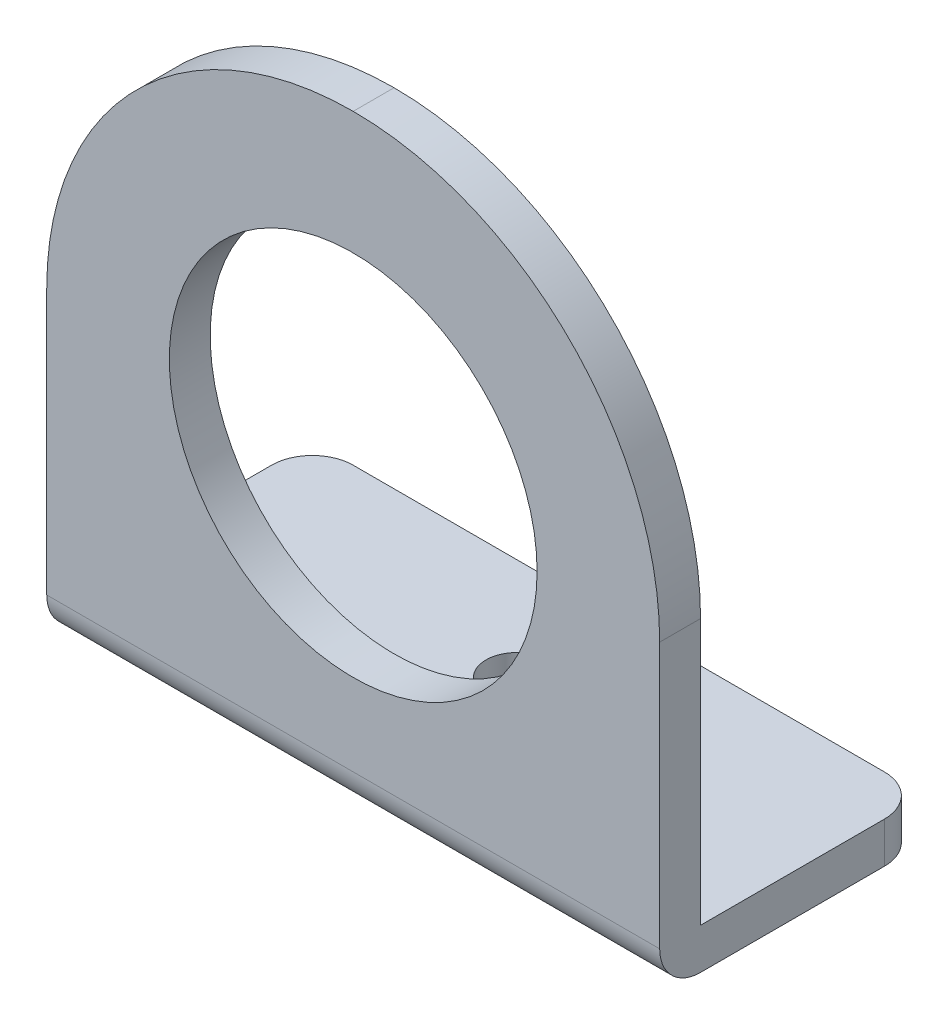
ISO-10303-21;
HEADER;
FILE_DESCRIPTION(('STEP AP214'),'2;1');
FILE_NAME('part.step','',(''),(''),'','','');
FILE_SCHEMA(('AUTOMOTIVE_DESIGN { 1 0 10303 214 1 1 1 1 }'));
ENDSEC;
DATA;
#1=APPLICATION_CONTEXT('core data for automotive mechanical design processes');
#2=APPLICATION_PROTOCOL_DEFINITION('international standard','automotive_design',2000,#1);
#3=PRODUCT_CONTEXT('',#1,'mechanical');
#4=PRODUCT('Part','Part','',(#3));
#5=PRODUCT_RELATED_PRODUCT_CATEGORY('part','',(#4));
#6=PRODUCT_DEFINITION_FORMATION('','',#4);
#7=PRODUCT_DEFINITION_CONTEXT('part definition',#1,'design');
#8=PRODUCT_DEFINITION('design','',#6,#7);
#9=PRODUCT_DEFINITION_SHAPE('','',#8);
#10=(LENGTH_UNIT() NAMED_UNIT(*) SI_UNIT(.MILLI.,.METRE.));
#11=(NAMED_UNIT(*) PLANE_ANGLE_UNIT() SI_UNIT($,.RADIAN.));
#12=(NAMED_UNIT(*) SI_UNIT($,.STERADIAN.) SOLID_ANGLE_UNIT());
#13=UNCERTAINTY_MEASURE_WITH_UNIT(LENGTH_MEASURE(1.E-05),#10,'distance_accuracy_value','');
#14=(GEOMETRIC_REPRESENTATION_CONTEXT(3) GLOBAL_UNCERTAINTY_ASSIGNED_CONTEXT((#13)) GLOBAL_UNIT_ASSIGNED_CONTEXT((#10,
#11,#12)) REPRESENTATION_CONTEXT('',''));
#15=CARTESIAN_POINT('',(0.,0.,0.));
#16=DIRECTION('',(0.,0.,1.));
#17=DIRECTION('',(1.,0.,0.));
#18=AXIS2_PLACEMENT_3D('',#15,#16,#17);
#19=CARTESIAN_POINT('',(-15.,15.,2.));
#20=DIRECTION('',(1.,0.,0.));
#21=DIRECTION('',(0.,1.,0.));
#22=AXIS2_PLACEMENT_3D('',#19,#20,#21);
#23=PLANE('',#22);
#24=DIRECTION('',(0.,0.,-1.));
#25=VECTOR('',#24,1.);
#26=CARTESIAN_POINT('',(-15.,-15.,2.));
#27=LINE('',#26,#25);
#28=CARTESIAN_POINT('',(-15.,-15.,0.));
#29=VERTEX_POINT('',#28);
#30=CARTESIAN_POINT('',(-15.,-15.,-9.));
#31=VERTEX_POINT('',#30);
#32=EDGE_CURVE('E161',#29,#31,#27,.T.);
#33=ORIENTED_EDGE('',*,*,#32,.F.);
#34=CARTESIAN_POINT('',(-15.,-13.,0.));
#35=DIRECTION('',(1.,0.,0.));
#36=DIRECTION('',(0.,1.,0.));
#37=AXIS2_PLACEMENT_3D('',#34,#35,#36);
#38=CIRCLE('',#37,2.);
#39=CARTESIAN_POINT('',(-15.,-13.,2.));
#40=VERTEX_POINT('',#39);
#41=EDGE_CURVE('E192',#29,#40,#38,.F.);
#42=ORIENTED_EDGE('',*,*,#41,.T.);
#43=DIRECTION('',(0.,-1.,0.));
#44=VECTOR('',#43,1.);
#45=CARTESIAN_POINT('',(-15.,15.,2.));
#46=LINE('',#45,#44);
#47=CARTESIAN_POINT('',(-15.,0.,2.));
#48=VERTEX_POINT('',#47);
#49=EDGE_CURVE('E131',#48,#40,#46,.T.);
#50=ORIENTED_EDGE('',*,*,#49,.F.);
#51=DIRECTION('',(0.,0.,-1.));
#52=VECTOR('',#51,1.);
#53=CARTESIAN_POINT('',(-15.,0.,2.));
#54=LINE('',#53,#52);
#55=CARTESIAN_POINT('',(-15.,0.,0.));
#56=VERTEX_POINT('',#55);
#57=EDGE_CURVE('E164',#48,#56,#54,.T.);
#58=ORIENTED_EDGE('',*,*,#57,.T.);
#59=DIRECTION('',(0.,-1.,0.));
#60=VECTOR('',#59,1.);
#61=CARTESIAN_POINT('',(-15.,15.,0.));
#62=LINE('',#61,#60);
#63=CARTESIAN_POINT('',(-15.,-13.,0.));
#64=VERTEX_POINT('',#63);
#65=EDGE_CURVE('E132',#56,#64,#62,.T.);
#66=ORIENTED_EDGE('',*,*,#65,.T.);
#67=DIRECTION('',(0.,0.,1.));
#68=VECTOR('',#67,1.);
#69=CARTESIAN_POINT('',(-15.,-13.,-11.));
#70=LINE('',#69,#68);
#71=CARTESIAN_POINT('',(-15.,-13.,-9.));
#72=VERTEX_POINT('',#71);
#73=EDGE_CURVE('E118',#72,#64,#70,.T.);
#74=ORIENTED_EDGE('',*,*,#73,.F.);
#75=DIRECTION('',(0.,1.,0.));
#76=VECTOR('',#75,1.);
#77=CARTESIAN_POINT('',(-15.,15.,-9.));
#78=LINE('',#77,#76);
#79=EDGE_CURVE('E190',#72,#31,#78,.F.);
#80=ORIENTED_EDGE('',*,*,#79,.T.);
#81=EDGE_LOOP('',(#33,#42,#50,#58,#66,#74,#80));
#82=FACE_BOUND('',#81,.T.);
#83=ADVANCED_FACE('F32',(#82),#23,.F.);
#84=CARTESIAN_POINT('',(15.,-15.,2.));
#85=DIRECTION('',(0.,1.,0.));
#86=DIRECTION('',(-1.,0.,0.));
#87=AXIS2_PLACEMENT_3D('',#84,#85,#86);
#88=PLANE('',#87);
#89=CARTESIAN_POINT('',(0.,-15.,-6.));
#90=DIRECTION('',(0.,1.,0.));
#91=DIRECTION('',(0.,0.,1.));
#92=AXIS2_PLACEMENT_3D('',#89,#90,#91);
#93=CIRCLE('',#92,1.5);
#94=CARTESIAN_POINT('',(0.,-15.,-4.5));
#95=VERTEX_POINT('',#94);
#96=EDGE_CURVE('E137',#95,#95,#93,.T.);
#97=ORIENTED_EDGE('',*,*,#96,.T.);
#98=EDGE_LOOP('',(#97));
#99=FACE_BOUND('',#98,.T.);
#100=DIRECTION('',(0.,0.,-1.));
#101=VECTOR('',#100,1.);
#102=CARTESIAN_POINT('',(15.,-15.,2.));
#103=LINE('',#102,#101);
#104=CARTESIAN_POINT('',(15.,-15.,0.));
#105=VERTEX_POINT('',#104);
#106=CARTESIAN_POINT('',(15.,-15.,-9.));
#107=VERTEX_POINT('',#106);
#108=EDGE_CURVE('E158',#105,#107,#103,.T.);
#109=ORIENTED_EDGE('',*,*,#108,.F.);
#110=DIRECTION('',(1.,0.,0.));
#111=VECTOR('',#110,1.);
#112=CARTESIAN_POINT('',(15.,-15.,0.));
#113=LINE('',#112,#111);
#114=EDGE_CURVE('E188',#105,#29,#113,.F.);
#115=ORIENTED_EDGE('',*,*,#114,.T.);
#116=ORIENTED_EDGE('',*,*,#32,.T.);
#117=CARTESIAN_POINT('',(-13.,-15.,-9.));
#118=DIRECTION('',(0.,1.,0.));
#119=DIRECTION('',(-1.,0.,0.));
#120=AXIS2_PLACEMENT_3D('',#117,#118,#119);
#121=CIRCLE('',#120,2.);
#122=CARTESIAN_POINT('',(-13.,-15.,-11.));
#123=VERTEX_POINT('',#122);
#124=EDGE_CURVE('E186',#31,#123,#121,.F.);
#125=ORIENTED_EDGE('',*,*,#124,.T.);
#126=DIRECTION('',(-1.,0.,0.));
#127=VECTOR('',#126,1.);
#128=CARTESIAN_POINT('',(15.,-15.,-11.));
#129=LINE('',#128,#127);
#130=CARTESIAN_POINT('',(13.,-15.,-11.));
#131=VERTEX_POINT('',#130);
#132=EDGE_CURVE('E136',#131,#123,#129,.T.);
#133=ORIENTED_EDGE('',*,*,#132,.F.);
#134=CARTESIAN_POINT('',(13.,-15.,-9.));
#135=DIRECTION('',(0.,1.,0.));
#136=DIRECTION('',(-1.,0.,0.));
#137=AXIS2_PLACEMENT_3D('',#134,#135,#136);
#138=CIRCLE('',#137,2.);
#139=EDGE_CURVE('E184',#131,#107,#138,.F.);
#140=ORIENTED_EDGE('',*,*,#139,.T.);
#141=EDGE_LOOP('',(#109,#115,#116,#125,#133,#140));
#142=FACE_BOUND('',#141,.T.);
#143=ADVANCED_FACE('F208',(#99,#142),#88,.F.);
#144=CARTESIAN_POINT('',(15.,15.,2.));
#145=DIRECTION('',(-1.,0.,0.));
#146=DIRECTION('',(0.,-1.,0.));
#147=AXIS2_PLACEMENT_3D('',#144,#145,#146);
#148=PLANE('',#147);
#149=DIRECTION('',(0.,1.,0.));
#150=VECTOR('',#149,1.);
#151=CARTESIAN_POINT('',(15.,15.,2.));
#152=LINE('',#151,#150);
#153=CARTESIAN_POINT('',(15.,-13.,2.));
#154=VERTEX_POINT('',#153);
#155=CARTESIAN_POINT('',(15.,0.,2.));
#156=VERTEX_POINT('',#155);
#157=EDGE_CURVE('E156',#154,#156,#152,.T.);
#158=ORIENTED_EDGE('',*,*,#157,.F.);
#159=CARTESIAN_POINT('',(15.,-13.,0.));
#160=DIRECTION('',(-1.,0.,0.));
#161=DIRECTION('',(0.,-1.,0.));
#162=AXIS2_PLACEMENT_3D('',#159,#160,#161);
#163=CIRCLE('',#162,2.);
#164=EDGE_CURVE('E182',#154,#105,#163,.F.);
#165=ORIENTED_EDGE('',*,*,#164,.T.);
#166=ORIENTED_EDGE('',*,*,#108,.T.);
#167=DIRECTION('',(0.,-1.,0.));
#168=VECTOR('',#167,1.);
#169=CARTESIAN_POINT('',(15.,15.,-9.));
#170=LINE('',#169,#168);
#171=CARTESIAN_POINT('',(15.,-13.,-9.));
#172=VERTEX_POINT('',#171);
#173=EDGE_CURVE('E116',#107,#172,#170,.F.);
#174=ORIENTED_EDGE('',*,*,#173,.T.);
#175=DIRECTION('',(0.,0.,1.));
#176=VECTOR('',#175,1.);
#177=CARTESIAN_POINT('',(15.,-13.,-11.));
#178=LINE('',#177,#176);
#179=CARTESIAN_POINT('',(15.,-13.,0.));
#180=VERTEX_POINT('',#179);
#181=EDGE_CURVE('E107',#172,#180,#178,.T.);
#182=ORIENTED_EDGE('',*,*,#181,.T.);
#183=DIRECTION('',(0.,1.,0.));
#184=VECTOR('',#183,1.);
#185=CARTESIAN_POINT('',(15.,15.,0.));
#186=LINE('',#185,#184);
#187=CARTESIAN_POINT('',(15.,0.,0.));
#188=VERTEX_POINT('',#187);
#189=EDGE_CURVE('E112',#180,#188,#186,.T.);
#190=ORIENTED_EDGE('',*,*,#189,.T.);
#191=DIRECTION('',(0.,0.,-1.));
#192=VECTOR('',#191,1.);
#193=CARTESIAN_POINT('',(15.,0.,2.));
#194=LINE('',#193,#192);
#195=EDGE_CURVE('E174',#188,#156,#194,.F.);
#196=ORIENTED_EDGE('',*,*,#195,.T.);
#197=EDGE_LOOP('',(#158,#165,#166,#174,#182,#190,#196));
#198=FACE_BOUND('',#197,.T.);
#199=ADVANCED_FACE('F110',(#198),#148,.F.);
#200=CARTESIAN_POINT('',(0.,0.,2.));
#201=DIRECTION('',(0.,0.,-1.));
#202=DIRECTION('',(-1.,0.,0.));
#203=AXIS2_PLACEMENT_3D('',#200,#201,#202);
#204=PLANE('',#203);
#205=CARTESIAN_POINT('',(0.,0.,2.));
#206=DIRECTION('',(0.,0.,1.));
#207=DIRECTION('',(1.,0.,0.));
#208=AXIS2_PLACEMENT_3D('',#205,#206,#207);
#209=CIRCLE('',#208,9.);
#210=CARTESIAN_POINT('',(9.,0.,2.));
#211=VERTEX_POINT('',#210);
#212=EDGE_CURVE('E151',#211,#211,#209,.T.);
#213=ORIENTED_EDGE('',*,*,#212,.F.);
#214=EDGE_LOOP('',(#213));
#215=FACE_BOUND('',#214,.T.);
#216=ORIENTED_EDGE('',*,*,#49,.T.);
#217=DIRECTION('',(1.,0.,0.));
#218=VECTOR('',#217,1.);
#219=CARTESIAN_POINT('',(0.,-13.,2.));
#220=LINE('',#219,#218);
#221=EDGE_CURVE('E176',#40,#154,#220,.T.);
#222=ORIENTED_EDGE('',*,*,#221,.T.);
#223=ORIENTED_EDGE('',*,*,#157,.T.);
#224=CARTESIAN_POINT('',(0.,0.,2.));
#225=DIRECTION('',(0.,0.,-1.));
#226=DIRECTION('',(-1.,0.,0.));
#227=AXIS2_PLACEMENT_3D('',#224,#225,#226);
#228=CIRCLE('',#227,15.);
#229=CARTESIAN_POINT('',(0.,15.,2.));
#230=VERTEX_POINT('',#229);
#231=EDGE_CURVE('E170',#156,#230,#228,.F.);
#232=ORIENTED_EDGE('',*,*,#231,.T.);
#233=CARTESIAN_POINT('',(0.,0.,2.));
#234=DIRECTION('',(0.,0.,-1.));
#235=DIRECTION('',(-1.,0.,0.));
#236=AXIS2_PLACEMENT_3D('',#233,#234,#235);
#237=CIRCLE('',#236,15.);
#238=EDGE_CURVE('E172',#230,#48,#237,.F.);
#239=ORIENTED_EDGE('',*,*,#238,.T.);
#240=EDGE_LOOP('',(#216,#222,#223,#232,#239));
#241=FACE_BOUND('',#240,.T.);
#242=ADVANCED_FACE('F216',(#215,#241),#204,.F.);
#243=CARTESIAN_POINT('',(0.,0.,0.));
#244=DIRECTION('',(0.,0.,-1.));
#245=DIRECTION('',(-1.,0.,0.));
#246=AXIS2_PLACEMENT_3D('',#243,#244,#245);
#247=PLANE('',#246);
#248=DIRECTION('',(1.,0.,0.));
#249=VECTOR('',#248,1.);
#250=CARTESIAN_POINT('',(15.,-13.,0.));
#251=LINE('',#250,#249);
#252=EDGE_CURVE('E126',#64,#180,#251,.T.);
#253=ORIENTED_EDGE('',*,*,#252,.F.);
#254=ORIENTED_EDGE('',*,*,#65,.F.);
#255=CARTESIAN_POINT('',(0.,0.,0.));
#256=DIRECTION('',(0.,0.,-1.));
#257=DIRECTION('',(-1.,0.,0.));
#258=AXIS2_PLACEMENT_3D('',#255,#256,#257);
#259=CIRCLE('',#258,15.);
#260=CARTESIAN_POINT('',(0.,15.,0.));
#261=VERTEX_POINT('',#260);
#262=EDGE_CURVE('E168',#56,#261,#259,.T.);
#263=ORIENTED_EDGE('',*,*,#262,.T.);
#264=CARTESIAN_POINT('',(0.,0.,0.));
#265=DIRECTION('',(0.,0.,-1.));
#266=DIRECTION('',(-1.,0.,0.));
#267=AXIS2_PLACEMENT_3D('',#264,#265,#266);
#268=CIRCLE('',#267,15.);
#269=EDGE_CURVE('E129',#261,#188,#268,.T.);
#270=ORIENTED_EDGE('',*,*,#269,.T.);
#271=ORIENTED_EDGE('',*,*,#189,.F.);
#272=EDGE_LOOP('',(#253,#254,#263,#270,#271));
#273=FACE_BOUND('',#272,.T.);
#274=CARTESIAN_POINT('',(0.,0.,0.));
#275=DIRECTION('',(0.,0.,1.));
#276=DIRECTION('',(1.,0.,0.));
#277=AXIS2_PLACEMENT_3D('',#274,#275,#276);
#278=CIRCLE('',#277,9.);
#279=CARTESIAN_POINT('',(9.,0.,0.));
#280=VERTEX_POINT('',#279);
#281=EDGE_CURVE('E148',#280,#280,#278,.T.);
#282=ORIENTED_EDGE('',*,*,#281,.T.);
#283=EDGE_LOOP('',(#282));
#284=FACE_BOUND('',#283,.T.);
#285=ADVANCED_FACE('F123',(#273,#284),#247,.T.);
#286=CARTESIAN_POINT('',(0.,0.,0.));
#287=DIRECTION('',(0.,0.,1.));
#288=DIRECTION('',(1.,0.,0.));
#289=AXIS2_PLACEMENT_3D('',#286,#287,#288);
#290=CYLINDRICAL_SURFACE('',#289,9.);
#291=ORIENTED_EDGE('',*,*,#281,.F.);
#292=EDGE_LOOP('',(#291));
#293=FACE_BOUND('',#292,.T.);
#294=ORIENTED_EDGE('',*,*,#212,.T.);
#295=EDGE_LOOP('',(#294));
#296=FACE_BOUND('',#295,.T.);
#297=ADVANCED_FACE('F233',(#293,#296),#290,.F.);
#298=CARTESIAN_POINT('',(0.,0.,2.));
#299=DIRECTION('',(0.,0.,-1.));
#300=DIRECTION('',(-1.,0.,0.));
#301=AXIS2_PLACEMENT_3D('',#298,#299,#300);
#302=CYLINDRICAL_SURFACE('',#301,15.);
#303=DIRECTION('',(0.,0.,-1.));
#304=VECTOR('',#303,1.);
#305=CARTESIAN_POINT('',(0.,15.,2.));
#306=LINE('',#305,#304);
#307=EDGE_CURVE('E147',#230,#261,#306,.T.);
#308=ORIENTED_EDGE('',*,*,#307,.F.);
#309=ORIENTED_EDGE('',*,*,#231,.F.);
#310=ORIENTED_EDGE('',*,*,#195,.F.);
#311=ORIENTED_EDGE('',*,*,#269,.F.);
#312=EDGE_LOOP('',(#308,#309,#310,#311));
#313=FACE_BOUND('',#312,.T.);
#314=ADVANCED_FACE('F220',(#313),#302,.T.);
#315=CARTESIAN_POINT('',(0.,0.,2.));
#316=DIRECTION('',(0.,0.,-1.));
#317=DIRECTION('',(-1.,0.,0.));
#318=AXIS2_PLACEMENT_3D('',#315,#316,#317);
#319=CYLINDRICAL_SURFACE('',#318,15.);
#320=ORIENTED_EDGE('',*,*,#238,.F.);
#321=ORIENTED_EDGE('',*,*,#307,.T.);
#322=ORIENTED_EDGE('',*,*,#262,.F.);
#323=ORIENTED_EDGE('',*,*,#57,.F.);
#324=EDGE_LOOP('',(#320,#321,#322,#323));
#325=FACE_BOUND('',#324,.T.);
#326=ADVANCED_FACE('F224',(#325),#319,.T.);
#327=CARTESIAN_POINT('',(15.,-13.,-11.));
#328=DIRECTION('',(0.,-1.,0.));
#329=DIRECTION('',(0.,0.,-1.));
#330=AXIS2_PLACEMENT_3D('',#327,#328,#329);
#331=PLANE('',#330);
#332=CARTESIAN_POINT('',(0.,-13.,-6.));
#333=DIRECTION('',(0.,1.,0.));
#334=DIRECTION('',(0.,0.,1.));
#335=AXIS2_PLACEMENT_3D('',#332,#333,#334);
#336=CIRCLE('',#335,1.5);
#337=CARTESIAN_POINT('',(0.,-13.,-4.5));
#338=VERTEX_POINT('',#337);
#339=EDGE_CURVE('E142',#338,#338,#336,.T.);
#340=ORIENTED_EDGE('',*,*,#339,.F.);
#341=EDGE_LOOP('',(#340));
#342=FACE_BOUND('',#341,.T.);
#343=DIRECTION('',(1.,0.,0.));
#344=VECTOR('',#343,1.);
#345=CARTESIAN_POINT('',(15.,-13.,-11.));
#346=LINE('',#345,#344);
#347=CARTESIAN_POINT('',(-13.,-13.,-11.));
#348=VERTEX_POINT('',#347);
#349=CARTESIAN_POINT('',(13.,-13.,-11.));
#350=VERTEX_POINT('',#349);
#351=EDGE_CURVE('E119',#348,#350,#346,.T.);
#352=ORIENTED_EDGE('',*,*,#351,.F.);
#353=CARTESIAN_POINT('',(-13.,-13.,-9.));
#354=DIRECTION('',(0.,-1.,0.));
#355=DIRECTION('',(0.,0.,-1.));
#356=AXIS2_PLACEMENT_3D('',#353,#354,#355);
#357=CIRCLE('',#356,2.);
#358=EDGE_CURVE('E11',#348,#72,#357,.F.);
#359=ORIENTED_EDGE('',*,*,#358,.T.);
#360=ORIENTED_EDGE('',*,*,#73,.T.);
#361=ORIENTED_EDGE('',*,*,#252,.T.);
#362=ORIENTED_EDGE('',*,*,#181,.F.);
#363=CARTESIAN_POINT('',(13.,-13.,-9.));
#364=DIRECTION('',(0.,-1.,0.));
#365=DIRECTION('',(0.,0.,-1.));
#366=AXIS2_PLACEMENT_3D('',#363,#364,#365);
#367=CIRCLE('',#366,2.);
#368=EDGE_CURVE('E40',#172,#350,#367,.F.);
#369=ORIENTED_EDGE('',*,*,#368,.T.);
#370=EDGE_LOOP('',(#352,#359,#360,#361,#362,#369));
#371=FACE_BOUND('',#370,.T.);
#372=ADVANCED_FACE('F134',(#342,#371),#331,.F.);
#373=CARTESIAN_POINT('',(0.,0.,-11.));
#374=DIRECTION('',(0.,0.,1.));
#375=DIRECTION('',(1.,0.,0.));
#376=AXIS2_PLACEMENT_3D('',#373,#374,#375);
#377=PLANE('',#376);
#378=ORIENTED_EDGE('',*,*,#132,.T.);
#379=DIRECTION('',(0.,1.,0.));
#380=VECTOR('',#379,1.);
#381=CARTESIAN_POINT('',(-13.,0.,-11.));
#382=LINE('',#381,#380);
#383=EDGE_CURVE('E197',#123,#348,#382,.T.);
#384=ORIENTED_EDGE('',*,*,#383,.T.);
#385=ORIENTED_EDGE('',*,*,#351,.T.);
#386=DIRECTION('',(0.,-1.,0.));
#387=VECTOR('',#386,1.);
#388=CARTESIAN_POINT('',(13.,0.,-11.));
#389=LINE('',#388,#387);
#390=EDGE_CURVE('E194',#350,#131,#389,.T.);
#391=ORIENTED_EDGE('',*,*,#390,.T.);
#392=EDGE_LOOP('',(#378,#384,#385,#391));
#393=FACE_BOUND('',#392,.T.);
#394=ADVANCED_FACE('F199',(#393),#377,.F.);
#395=CARTESIAN_POINT('',(0.,-15.,-6.));
#396=DIRECTION('',(0.,1.,0.));
#397=DIRECTION('',(0.,0.,1.));
#398=AXIS2_PLACEMENT_3D('',#395,#396,#397);
#399=CYLINDRICAL_SURFACE('',#398,1.5);
#400=ORIENTED_EDGE('',*,*,#96,.F.);
#401=EDGE_LOOP('',(#400));
#402=FACE_BOUND('',#401,.T.);
#403=ORIENTED_EDGE('',*,*,#339,.T.);
#404=EDGE_LOOP('',(#403));
#405=FACE_BOUND('',#404,.T.);
#406=ADVANCED_FACE('F255',(#402,#405),#399,.F.);
#407=CARTESIAN_POINT('',(0.,-13.,0.));
#408=DIRECTION('',(1.,0.,0.));
#409=DIRECTION('',(0.,1.,0.));
#410=AXIS2_PLACEMENT_3D('',#407,#408,#409);
#411=CYLINDRICAL_SURFACE('',#410,2.);
#412=ORIENTED_EDGE('',*,*,#41,.F.);
#413=ORIENTED_EDGE('',*,*,#114,.F.);
#414=ORIENTED_EDGE('',*,*,#164,.F.);
#415=ORIENTED_EDGE('',*,*,#221,.F.);
#416=EDGE_LOOP('',(#412,#413,#414,#415));
#417=FACE_BOUND('',#416,.T.);
#418=ADVANCED_FACE('F214',(#417),#411,.T.);
#419=CARTESIAN_POINT('',(-13.,0.,-9.));
#420=DIRECTION('',(0.,1.,0.));
#421=DIRECTION('',(-1.,0.,0.));
#422=AXIS2_PLACEMENT_3D('',#419,#420,#421);
#423=CYLINDRICAL_SURFACE('',#422,2.);
#424=ORIENTED_EDGE('',*,*,#124,.F.);
#425=ORIENTED_EDGE('',*,*,#79,.F.);
#426=ORIENTED_EDGE('',*,*,#358,.F.);
#427=ORIENTED_EDGE('',*,*,#383,.F.);
#428=EDGE_LOOP('',(#424,#425,#426,#427));
#429=FACE_BOUND('',#428,.T.);
#430=ADVANCED_FACE('F205',(#429),#423,.T.);
#431=CARTESIAN_POINT('',(13.,0.,-9.));
#432=DIRECTION('',(0.,-1.,0.));
#433=DIRECTION('',(1.,0.,0.));
#434=AXIS2_PLACEMENT_3D('',#431,#432,#433);
#435=CYLINDRICAL_SURFACE('',#434,2.);
#436=ORIENTED_EDGE('',*,*,#368,.F.);
#437=ORIENTED_EDGE('',*,*,#173,.F.);
#438=ORIENTED_EDGE('',*,*,#139,.F.);
#439=ORIENTED_EDGE('',*,*,#390,.F.);
#440=EDGE_LOOP('',(#436,#437,#438,#439));
#441=FACE_BOUND('',#440,.T.);
#442=ADVANCED_FACE('F34',(#441),#435,.T.);
#443=CLOSED_SHELL('',(#83,#143,#199,#242,#285,#297,#314,#326,#372,#394,#406,#418,#430,#442));
#444=MANIFOLD_SOLID_BREP('B2',#443);
#445=ADVANCED_BREP_SHAPE_REPRESENTATION('',(#18,#444),#14);
#446=SHAPE_DEFINITION_REPRESENTATION(#9,#445);
ENDSEC;
END-ISO-10303-21;
